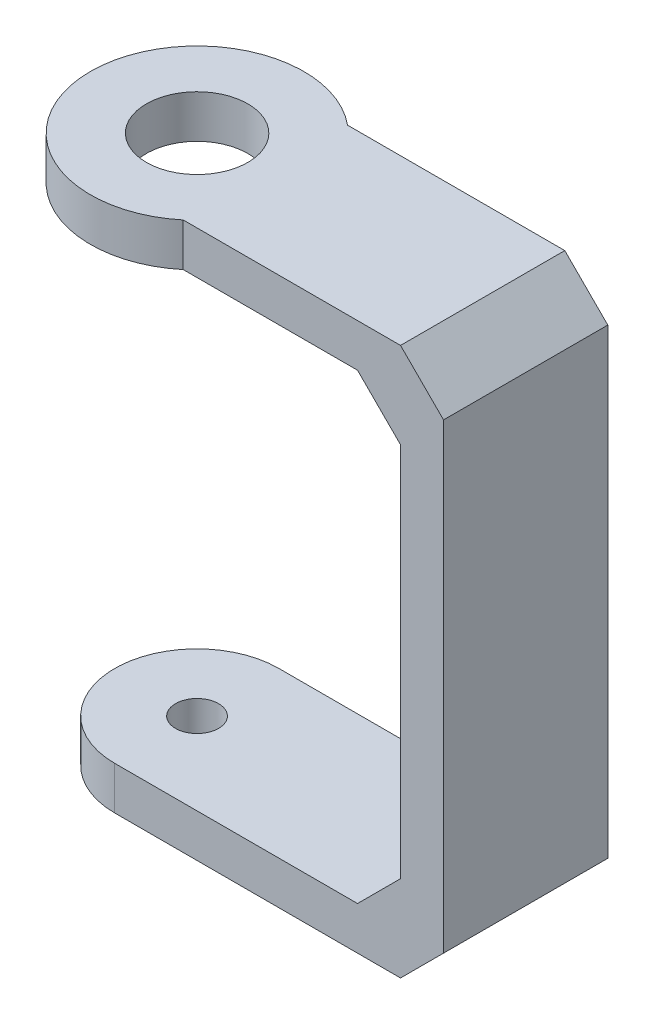
ISO-10303-21;
HEADER;
FILE_DESCRIPTION(('STEP AP214'),'2;1');
FILE_NAME('part.step','',(''),(''),'','','');
FILE_SCHEMA(('AUTOMOTIVE_DESIGN { 1 0 10303 214 1 1 1 1 }'));
ENDSEC;
DATA;
#1=APPLICATION_CONTEXT('core data for automotive mechanical design processes');
#2=APPLICATION_PROTOCOL_DEFINITION('international standard','automotive_design',2000,#1);
#3=PRODUCT_CONTEXT('',#1,'mechanical');
#4=PRODUCT('Part','Part','',(#3));
#5=PRODUCT_RELATED_PRODUCT_CATEGORY('part','',(#4));
#6=PRODUCT_DEFINITION_FORMATION('','',#4);
#7=PRODUCT_DEFINITION_CONTEXT('part definition',#1,'design');
#8=PRODUCT_DEFINITION('design','',#6,#7);
#9=PRODUCT_DEFINITION_SHAPE('','',#8);
#10=(LENGTH_UNIT() NAMED_UNIT(*) SI_UNIT(.MILLI.,.METRE.));
#11=(NAMED_UNIT(*) PLANE_ANGLE_UNIT() SI_UNIT($,.RADIAN.));
#12=(NAMED_UNIT(*) SI_UNIT($,.STERADIAN.) SOLID_ANGLE_UNIT());
#13=UNCERTAINTY_MEASURE_WITH_UNIT(LENGTH_MEASURE(1.E-05),#10,'distance_accuracy_value','');
#14=(GEOMETRIC_REPRESENTATION_CONTEXT(3) GLOBAL_UNCERTAINTY_ASSIGNED_CONTEXT((#13)) GLOBAL_UNIT_ASSIGNED_CONTEXT((#10,
#11,#12)) REPRESENTATION_CONTEXT('',''));
#15=CARTESIAN_POINT('',(0.,0.,0.));
#16=DIRECTION('',(0.,0.,1.));
#17=DIRECTION('',(1.,0.,0.));
#18=AXIS2_PLACEMENT_3D('',#15,#16,#17);
#19=CARTESIAN_POINT('',(23.7360999092236,38.9968362191147,-5.73));
#20=DIRECTION('',(0.70710700070138,0.707106561671647,0.));
#21=DIRECTION('',(-0.707106561671647,0.70710700070138,0.));
#22=AXIS2_PLACEMENT_3D('',#19,#20,#21);
#23=PLANE('',#22);
#24=DIRECTION('',(0.,0.,1.));
#25=VECTOR('',#24,1.);
#26=CARTESIAN_POINT('',(23.7360999092236,38.9968362191147,-5.73));
#27=LINE('',#26,#25);
#28=CARTESIAN_POINT('',(23.7360999092236,38.9968362191147,-5.73));
#29=VERTEX_POINT('',#28);
#30=CARTESIAN_POINT('',(23.7360999092236,38.9968362191147,5.73));
#31=VERTEX_POINT('',#30);
#32=EDGE_CURVE('E11',#29,#31,#27,.T.);
#33=ORIENTED_EDGE('',*,*,#32,.T.);
#34=DIRECTION('',(-0.707106561671647,0.70710700070138,0.));
#35=VECTOR('',#34,1.);
#36=CARTESIAN_POINT('',(23.7360999092236,38.9968362191147,5.73));
#37=LINE('',#36,#35);
#38=CARTESIAN_POINT('',(26.7361004009619,35.9968338647301,5.73));
#39=VERTEX_POINT('',#38);
#40=EDGE_CURVE('E202',#39,#31,#37,.T.);
#41=ORIENTED_EDGE('',*,*,#40,.F.);
#42=DIRECTION('',(0.,0.,1.));
#43=VECTOR('',#42,1.);
#44=CARTESIAN_POINT('',(26.7361004009619,35.9968338647301,-5.73));
#45=LINE('',#44,#43);
#46=CARTESIAN_POINT('',(26.7361004009619,35.9968338647301,-5.73));
#47=VERTEX_POINT('',#46);
#48=EDGE_CURVE('E42',#47,#39,#45,.T.);
#49=ORIENTED_EDGE('',*,*,#48,.F.);
#50=DIRECTION('',(-0.707106561671647,0.70710700070138,0.));
#51=VECTOR('',#50,1.);
#52=CARTESIAN_POINT('',(23.7360999092236,38.9968362191147,-5.73));
#53=LINE('',#52,#51);
#54=EDGE_CURVE('E49',#47,#29,#53,.T.);
#55=ORIENTED_EDGE('',*,*,#54,.T.);
#56=EDGE_LOOP('',(#33,#41,#49,#55));
#57=FACE_BOUND('',#56,.T.);
#58=ADVANCED_FACE('F33',(#57),#23,.T.);
#59=CARTESIAN_POINT('',(26.7361004009619,35.9968338647301,-5.73));
#60=DIRECTION('',(1.,0.,0.));
#61=DIRECTION('',(0.,1.,0.));
#62=AXIS2_PLACEMENT_3D('',#59,#60,#61);
#63=PLANE('',#62);
#64=ORIENTED_EDGE('',*,*,#48,.T.);
#65=DIRECTION('',(0.,1.,0.));
#66=VECTOR('',#65,1.);
#67=CARTESIAN_POINT('',(26.7361004009619,35.9968338647301,5.73));
#68=LINE('',#67,#66);
#69=CARTESIAN_POINT('',(26.7361004009619,3.77683532623596,5.73));
#70=VERTEX_POINT('',#69);
#71=EDGE_CURVE('E199',#70,#39,#68,.T.);
#72=ORIENTED_EDGE('',*,*,#71,.F.);
#73=DIRECTION('',(0.,0.,1.));
#74=VECTOR('',#73,1.);
#75=CARTESIAN_POINT('',(26.7361004009619,3.77683532623596,-5.73));
#76=LINE('',#75,#74);
#77=CARTESIAN_POINT('',(26.7361004009619,3.77683532623596,-5.73));
#78=VERTEX_POINT('',#77);
#79=EDGE_CURVE('E219',#78,#70,#76,.T.);
#80=ORIENTED_EDGE('',*,*,#79,.F.);
#81=DIRECTION('',(0.,1.,0.));
#82=VECTOR('',#81,1.);
#83=CARTESIAN_POINT('',(26.7361004009619,35.9968338647301,-5.73));
#84=LINE('',#83,#82);
#85=EDGE_CURVE('E215',#78,#47,#84,.T.);
#86=ORIENTED_EDGE('',*,*,#85,.T.);
#87=EDGE_LOOP('',(#64,#72,#80,#86));
#88=FACE_BOUND('',#87,.T.);
#89=ADVANCED_FACE('F257',(#88),#63,.T.);
#90=CARTESIAN_POINT('',(26.7361004009619,3.77683532623596,-5.73));
#91=DIRECTION('',(0.707106561671646,-0.707107000701381,0.));
#92=DIRECTION('',(0.707107000701381,0.707106561671646,0.));
#93=AXIS2_PLACEMENT_3D('',#90,#91,#92);
#94=PLANE('',#93);
#95=ORIENTED_EDGE('',*,*,#79,.T.);
#96=DIRECTION('',(0.707107000701381,0.707106561671646,0.));
#97=VECTOR('',#96,1.);
#98=CARTESIAN_POINT('',(26.7361004009619,3.77683532623596,5.73));
#99=LINE('',#98,#97);
#100=CARTESIAN_POINT('',(23.7360989779003,0.776835765820073,5.73));
#101=VERTEX_POINT('',#100);
#102=EDGE_CURVE('E196',#101,#70,#99,.T.);
#103=ORIENTED_EDGE('',*,*,#102,.F.);
#104=DIRECTION('',(0.,0.,1.));
#105=VECTOR('',#104,1.);
#106=CARTESIAN_POINT('',(23.7360989779003,0.776835765820073,-5.73));
#107=LINE('',#106,#105);
#108=CARTESIAN_POINT('',(23.7360989779003,0.776835765820073,-5.73));
#109=VERTEX_POINT('',#108);
#110=EDGE_CURVE('E221',#109,#101,#107,.T.);
#111=ORIENTED_EDGE('',*,*,#110,.F.);
#112=DIRECTION('',(0.707107000701381,0.707106561671646,0.));
#113=VECTOR('',#112,1.);
#114=CARTESIAN_POINT('',(26.7361004009619,3.77683532623596,-5.73));
#115=LINE('',#114,#113);
#116=EDGE_CURVE('E212',#109,#78,#115,.T.);
#117=ORIENTED_EDGE('',*,*,#116,.T.);
#118=EDGE_LOOP('',(#95,#103,#111,#117));
#119=FACE_BOUND('',#118,.T.);
#120=ADVANCED_FACE('F262',(#119),#94,.T.);
#121=CARTESIAN_POINT('',(20.7360984861625,3.77683812020412,-5.73));
#122=DIRECTION('',(-0.707106561671645,0.707107000701382,0.));
#123=DIRECTION('',(-0.707107000701382,-0.707106561671645,0.));
#124=AXIS2_PLACEMENT_3D('',#121,#122,#123);
#125=PLANE('',#124);
#126=DIRECTION('',(0.,0.,1.));
#127=VECTOR('',#126,1.);
#128=CARTESIAN_POINT('',(20.7360984861625,3.77683812020412,-5.73));
#129=LINE('',#128,#127);
#130=CARTESIAN_POINT('',(20.7360984861625,3.77683812020412,-5.73));
#131=VERTEX_POINT('',#130);
#132=CARTESIAN_POINT('',(20.7360984861625,3.77683812020412,5.73));
#133=VERTEX_POINT('',#132);
#134=EDGE_CURVE('E224',#131,#133,#129,.T.);
#135=ORIENTED_EDGE('',*,*,#134,.T.);
#136=DIRECTION('',(-0.707107000701382,-0.707106561671645,0.));
#137=VECTOR('',#136,1.);
#138=CARTESIAN_POINT('',(20.7360984861625,3.77683812020412,5.73));
#139=LINE('',#138,#137);
#140=CARTESIAN_POINT('',(23.7360989779009,6.77683674929729,5.73));
#141=VERTEX_POINT('',#140);
#142=EDGE_CURVE('E131',#141,#133,#139,.T.);
#143=ORIENTED_EDGE('',*,*,#142,.F.);
#144=DIRECTION('',(0.,0.,1.));
#145=VECTOR('',#144,1.);
#146=CARTESIAN_POINT('',(23.7360989779009,6.77683674929729,-5.73));
#147=LINE('',#146,#145);
#148=CARTESIAN_POINT('',(23.7360989779009,6.77683674929729,-5.73));
#149=VERTEX_POINT('',#148);
#150=EDGE_CURVE('E226',#149,#141,#147,.T.);
#151=ORIENTED_EDGE('',*,*,#150,.F.);
#152=DIRECTION('',(-0.707107000701382,-0.707106561671645,0.));
#153=VECTOR('',#152,1.);
#154=CARTESIAN_POINT('',(20.7360984861625,3.77683812020412,-5.73));
#155=LINE('',#154,#153);
#156=EDGE_CURVE('E210',#149,#131,#155,.T.);
#157=ORIENTED_EDGE('',*,*,#156,.T.);
#158=EDGE_LOOP('',(#135,#143,#151,#157));
#159=FACE_BOUND('',#158,.T.);
#160=ADVANCED_FACE('F254',(#159),#125,.T.);
#161=CARTESIAN_POINT('',(23.7360989779009,6.77683674929729,-5.73));
#162=DIRECTION('',(-1.,0.,0.));
#163=DIRECTION('',(0.,0.,1.));
#164=AXIS2_PLACEMENT_3D('',#161,#162,#163);
#165=PLANE('',#164);
#166=ORIENTED_EDGE('',*,*,#150,.T.);
#167=DIRECTION('',(0.,-1.,0.));
#168=VECTOR('',#167,1.);
#169=CARTESIAN_POINT('',(23.7360989779009,6.77683674929729,5.73));
#170=LINE('',#169,#168);
#171=CARTESIAN_POINT('',(23.7360989779009,32.9968380296051,5.73));
#172=VERTEX_POINT('',#171);
#173=EDGE_CURVE('E193',#172,#141,#170,.T.);
#174=ORIENTED_EDGE('',*,*,#173,.F.);
#175=DIRECTION('',(0.,0.,1.));
#176=VECTOR('',#175,1.);
#177=CARTESIAN_POINT('',(23.7360989779009,32.9968380296051,-5.73));
#178=LINE('',#177,#176);
#179=CARTESIAN_POINT('',(23.7360989779009,32.9968380296051,-5.73));
#180=VERTEX_POINT('',#179);
#181=EDGE_CURVE('E227',#180,#172,#178,.T.);
#182=ORIENTED_EDGE('',*,*,#181,.F.);
#183=DIRECTION('',(0.,-1.,0.));
#184=VECTOR('',#183,1.);
#185=CARTESIAN_POINT('',(23.7360989779009,6.77683674929729,-5.73));
#186=LINE('',#185,#184);
#187=EDGE_CURVE('E207',#180,#149,#186,.T.);
#188=ORIENTED_EDGE('',*,*,#187,.T.);
#189=EDGE_LOOP('',(#166,#174,#182,#188));
#190=FACE_BOUND('',#189,.T.);
#191=ADVANCED_FACE('F248',(#190),#165,.T.);
#192=CARTESIAN_POINT('',(23.7360989779009,32.9968380296051,-5.73));
#193=DIRECTION('',(-0.70710700070138,-0.707106561671647,0.));
#194=DIRECTION('',(0.707106561671647,-0.70710700070138,0.));
#195=AXIS2_PLACEMENT_3D('',#192,#193,#194);
#196=PLANE('',#195);
#197=ORIENTED_EDGE('',*,*,#181,.T.);
#198=DIRECTION('',(0.707106561671647,-0.70710700070138,0.));
#199=VECTOR('',#198,1.);
#200=CARTESIAN_POINT('',(23.7360989779009,32.9968380296051,5.73));
#201=LINE('',#200,#199);
#202=CARTESIAN_POINT('',(20.7361003488077,35.9968385213434,5.73));
#203=VERTEX_POINT('',#202);
#204=EDGE_CURVE('E188',#203,#172,#201,.T.);
#205=ORIENTED_EDGE('',*,*,#204,.F.);
#206=DIRECTION('',(0.,0.,1.));
#207=VECTOR('',#206,1.);
#208=CARTESIAN_POINT('',(20.7361003488077,35.9968385213434,-5.73));
#209=LINE('',#208,#207);
#210=CARTESIAN_POINT('',(20.7361003488077,35.9968385213434,-5.73));
#211=VERTEX_POINT('',#210);
#212=EDGE_CURVE('E37',#211,#203,#209,.T.);
#213=ORIENTED_EDGE('',*,*,#212,.F.);
#214=DIRECTION('',(0.707106561671647,-0.70710700070138,0.));
#215=VECTOR('',#214,1.);
#216=CARTESIAN_POINT('',(23.7360989779009,32.9968380296051,-5.73));
#217=LINE('',#216,#215);
#218=EDGE_CURVE('E204',#211,#180,#217,.T.);
#219=ORIENTED_EDGE('',*,*,#218,.T.);
#220=EDGE_LOOP('',(#197,#205,#213,#219));
#221=FACE_BOUND('',#220,.T.);
#222=ADVANCED_FACE('F35',(#221),#196,.T.);
#223=CARTESIAN_POINT('',(0.,0.,-5.73));
#224=DIRECTION('',(0.,0.,-1.));
#225=DIRECTION('',(-1.,0.,0.));
#226=AXIS2_PLACEMENT_3D('',#223,#224,#225);
#227=PLANE('',#226);
#228=ORIENTED_EDGE('',*,*,#218,.F.);
#229=DIRECTION('',(1.,0.,0.));
#230=VECTOR('',#229,1.);
#231=CARTESIAN_POINT('',(8.57610034880768,35.9968385213434,-5.73));
#232=LINE('',#231,#230);
#233=CARTESIAN_POINT('',(8.57610034880768,35.9968362191147,-5.73));
#234=VERTEX_POINT('',#233);
#235=EDGE_CURVE('E136',#234,#211,#232,.T.);
#236=ORIENTED_EDGE('',*,*,#235,.F.);
#237=DIRECTION('',(0.,-1.,0.));
#238=VECTOR('',#237,1.);
#239=CARTESIAN_POINT('',(8.57610034880768,38.9968362191147,-5.73));
#240=LINE('',#239,#238);
#241=CARTESIAN_POINT('',(8.57610034880768,38.9968362191147,-5.73));
#242=VERTEX_POINT('',#241);
#243=EDGE_CURVE('E173',#242,#234,#240,.T.);
#244=ORIENTED_EDGE('',*,*,#243,.F.);
#245=DIRECTION('',(-1.,0.,0.));
#246=VECTOR('',#245,1.);
#247=CARTESIAN_POINT('',(20.7361003488077,38.9968362191147,-5.73));
#248=LINE('',#247,#246);
#249=EDGE_CURVE('E170',#29,#242,#248,.T.);
#250=ORIENTED_EDGE('',*,*,#249,.F.);
#251=ORIENTED_EDGE('',*,*,#54,.F.);
#252=ORIENTED_EDGE('',*,*,#85,.F.);
#253=ORIENTED_EDGE('',*,*,#116,.F.);
#254=DIRECTION('',(1.,0.,0.));
#255=VECTOR('',#254,1.);
#256=CARTESIAN_POINT('',(8.57609848616254,0.776835765820071,-5.73));
#257=LINE('',#256,#255);
#258=CARTESIAN_POINT('',(3.79307817414659,0.776835765820073,-5.73));
#259=VERTEX_POINT('',#258);
#260=EDGE_CURVE('E186',#259,#109,#257,.T.);
#261=ORIENTED_EDGE('',*,*,#260,.F.);
#262=DIRECTION('',(0.,-1.,0.));
#263=VECTOR('',#262,1.);
#264=CARTESIAN_POINT('',(3.79307817414659,3.77683576582007,-5.73));
#265=LINE('',#264,#263);
#266=CARTESIAN_POINT('',(3.79307817414659,3.77683576582007,-5.73));
#267=VERTEX_POINT('',#266);
#268=EDGE_CURVE('E145',#267,#259,#265,.T.);
#269=ORIENTED_EDGE('',*,*,#268,.F.);
#270=DIRECTION('',(-1.,0.,0.));
#271=VECTOR('',#270,1.);
#272=CARTESIAN_POINT('',(20.7360984861625,3.77683812020412,-5.73));
#273=LINE('',#272,#271);
#274=EDGE_CURVE('E149',#131,#267,#273,.T.);
#275=ORIENTED_EDGE('',*,*,#274,.F.);
#276=ORIENTED_EDGE('',*,*,#156,.F.);
#277=ORIENTED_EDGE('',*,*,#187,.F.);
#278=EDGE_LOOP('',(#228,#236,#244,#250,#251,#252,#253,#261,#269,#275,#276,#277));
#279=FACE_BOUND('',#278,.T.);
#280=ADVANCED_FACE('F243',(#279),#227,.T.);
#281=CARTESIAN_POINT('',(0.,0.,5.73));
#282=DIRECTION('',(0.,0.,-1.));
#283=DIRECTION('',(-1.,0.,0.));
#284=AXIS2_PLACEMENT_3D('',#281,#282,#283);
#285=PLANE('',#284);
#286=ORIENTED_EDGE('',*,*,#40,.T.);
#287=DIRECTION('',(-1.,0.,0.));
#288=VECTOR('',#287,1.);
#289=CARTESIAN_POINT('',(20.7361003488077,38.9968362191147,5.73));
#290=LINE('',#289,#288);
#291=CARTESIAN_POINT('',(8.57610034880768,38.9968362191147,5.73));
#292=VERTEX_POINT('',#291);
#293=EDGE_CURVE('E168',#31,#292,#290,.T.);
#294=ORIENTED_EDGE('',*,*,#293,.T.);
#295=DIRECTION('',(0.,-1.,0.));
#296=VECTOR('',#295,1.);
#297=CARTESIAN_POINT('',(8.57610034880768,38.9968362191147,5.73));
#298=LINE('',#297,#296);
#299=CARTESIAN_POINT('',(8.57610034880768,35.9968362191147,5.73));
#300=VERTEX_POINT('',#299);
#301=EDGE_CURVE('E180',#292,#300,#298,.T.);
#302=ORIENTED_EDGE('',*,*,#301,.T.);
#303=DIRECTION('',(1.,0.,0.));
#304=VECTOR('',#303,1.);
#305=CARTESIAN_POINT('',(8.57610034880768,35.9968385213434,5.73));
#306=LINE('',#305,#304);
#307=EDGE_CURVE('E174',#300,#203,#306,.T.);
#308=ORIENTED_EDGE('',*,*,#307,.T.);
#309=ORIENTED_EDGE('',*,*,#204,.T.);
#310=ORIENTED_EDGE('',*,*,#173,.T.);
#311=ORIENTED_EDGE('',*,*,#142,.T.);
#312=DIRECTION('',(-1.,0.,0.));
#313=VECTOR('',#312,1.);
#314=CARTESIAN_POINT('',(20.7360984861625,3.77683812020412,5.73));
#315=LINE('',#314,#313);
#316=CARTESIAN_POINT('',(3.79307817414659,3.77683576582007,5.73));
#317=VERTEX_POINT('',#316);
#318=EDGE_CURVE('E122',#133,#317,#315,.T.);
#319=ORIENTED_EDGE('',*,*,#318,.T.);
#320=DIRECTION('',(0.,-1.,0.));
#321=VECTOR('',#320,1.);
#322=CARTESIAN_POINT('',(3.79307817414659,3.77683576582007,5.73));
#323=LINE('',#322,#321);
#324=CARTESIAN_POINT('',(3.79307817414659,0.776835765820073,5.73));
#325=VERTEX_POINT('',#324);
#326=EDGE_CURVE('E127',#317,#325,#323,.T.);
#327=ORIENTED_EDGE('',*,*,#326,.T.);
#328=DIRECTION('',(-1.,0.,0.));
#329=VECTOR('',#328,1.);
#330=CARTESIAN_POINT('',(23.7360989779003,0.776835765820073,5.73));
#331=LINE('',#330,#329);
#332=EDGE_CURVE('E135',#101,#325,#331,.T.);
#333=ORIENTED_EDGE('',*,*,#332,.F.);
#334=ORIENTED_EDGE('',*,*,#102,.T.);
#335=ORIENTED_EDGE('',*,*,#71,.T.);
#336=EDGE_LOOP('',(#286,#294,#302,#308,#309,#310,#311,#319,#327,#333,#334,#335));
#337=FACE_BOUND('',#336,.T.);
#338=ADVANCED_FACE('F125',(#337),#285,.F.);
#339=CARTESIAN_POINT('',(23.7360989779003,0.776835765820073,-5.73));
#340=DIRECTION('',(0.,1.,0.));
#341=DIRECTION('',(0.,0.,1.));
#342=AXIS2_PLACEMENT_3D('',#339,#340,#341);
#343=PLANE('',#342);
#344=CARTESIAN_POINT('',(3.81,0.776838120204118,0.));
#345=DIRECTION('',(0.,1.,0.));
#346=DIRECTION('',(-1.,0.,0.));
#347=AXIS2_PLACEMENT_3D('',#344,#345,#346);
#348=CIRCLE('',#347,1.5);
#349=CARTESIAN_POINT('',(2.31,0.776838120204118,0.));
#350=VERTEX_POINT('',#349);
#351=EDGE_CURVE('E152',#350,#350,#348,.T.);
#352=ORIENTED_EDGE('',*,*,#351,.T.);
#353=EDGE_LOOP('',(#352));
#354=FACE_BOUND('',#353,.T.);
#355=ORIENTED_EDGE('',*,*,#332,.T.);
#356=CARTESIAN_POINT('',(3.79307817414659,0.776835765820073,0.));
#357=DIRECTION('',(0.,-1.,0.));
#358=DIRECTION('',(0.,0.,-1.));
#359=AXIS2_PLACEMENT_3D('',#356,#357,#358);
#360=CIRCLE('',#359,5.73);
#361=EDGE_CURVE('E144',#325,#259,#360,.T.);
#362=ORIENTED_EDGE('',*,*,#361,.T.);
#363=ORIENTED_EDGE('',*,*,#260,.T.);
#364=ORIENTED_EDGE('',*,*,#110,.T.);
#365=EDGE_LOOP('',(#355,#362,#363,#364));
#366=FACE_BOUND('',#365,.T.);
#367=ADVANCED_FACE('F275',(#354,#366),#343,.F.);
#368=CARTESIAN_POINT('',(20.7360984861625,3.77683812020412,-5.73));
#369=DIRECTION('',(0.,1.,0.));
#370=DIRECTION('',(-1.,0.,0.));
#371=AXIS2_PLACEMENT_3D('',#368,#369,#370);
#372=PLANE('',#371);
#373=CARTESIAN_POINT('',(3.81,3.77683812020412,0.));
#374=DIRECTION('',(0.,1.,0.));
#375=DIRECTION('',(-1.,0.,0.));
#376=AXIS2_PLACEMENT_3D('',#373,#374,#375);
#377=CIRCLE('',#376,1.5);
#378=CARTESIAN_POINT('',(2.31,3.77683812020412,0.));
#379=VERTEX_POINT('',#378);
#380=EDGE_CURVE('E155',#379,#379,#377,.T.);
#381=ORIENTED_EDGE('',*,*,#380,.F.);
#382=EDGE_LOOP('',(#381));
#383=FACE_BOUND('',#382,.T.);
#384=ORIENTED_EDGE('',*,*,#318,.F.);
#385=ORIENTED_EDGE('',*,*,#134,.F.);
#386=ORIENTED_EDGE('',*,*,#274,.T.);
#387=CARTESIAN_POINT('',(3.79307817414659,3.77683576582007,0.));
#388=DIRECTION('',(0.,-1.,0.));
#389=DIRECTION('',(0.,0.,-1.));
#390=AXIS2_PLACEMENT_3D('',#387,#388,#389);
#391=CIRCLE('',#390,5.73);
#392=EDGE_CURVE('E142',#317,#267,#391,.T.);
#393=ORIENTED_EDGE('',*,*,#392,.F.);
#394=EDGE_LOOP('',(#384,#385,#386,#393));
#395=FACE_BOUND('',#394,.T.);
#396=ADVANCED_FACE('F147',(#383,#395),#372,.T.);
#397=CARTESIAN_POINT('',(8.57610034880768,35.9968385213434,-5.73));
#398=DIRECTION('',(0.,-1.,0.));
#399=DIRECTION('',(0.,0.,-1.));
#400=AXIS2_PLACEMENT_3D('',#397,#398,#399);
#401=PLANE('',#400);
#402=CARTESIAN_POINT('',(3.81484001146002,35.9968362191147,0.));
#403=DIRECTION('',(0.,1.,0.));
#404=DIRECTION('',(0.,0.,1.));
#405=AXIS2_PLACEMENT_3D('',#402,#403,#404);
#406=CIRCLE('',#405,3.54);
#407=CARTESIAN_POINT('',(3.81484001146002,35.9968362191147,3.54));
#408=VERTEX_POINT('',#407);
#409=EDGE_CURVE('E160',#408,#408,#406,.T.);
#410=ORIENTED_EDGE('',*,*,#409,.T.);
#411=EDGE_LOOP('',(#410));
#412=FACE_BOUND('',#411,.T.);
#413=ORIENTED_EDGE('',*,*,#307,.F.);
#414=CARTESIAN_POINT('',(3.81484001146002,35.9968362191147,0.));
#415=DIRECTION('',(0.,1.,0.));
#416=DIRECTION('',(0.,0.,1.));
#417=AXIS2_PLACEMENT_3D('',#414,#415,#416);
#418=CIRCLE('',#417,7.45);
#419=EDGE_CURVE('E166',#234,#300,#418,.T.);
#420=ORIENTED_EDGE('',*,*,#419,.F.);
#421=ORIENTED_EDGE('',*,*,#235,.T.);
#422=ORIENTED_EDGE('',*,*,#212,.T.);
#423=EDGE_LOOP('',(#413,#420,#421,#422));
#424=FACE_BOUND('',#423,.T.);
#425=ADVANCED_FACE('F233',(#412,#424),#401,.T.);
#426=CARTESIAN_POINT('',(20.7361003488077,38.9968362191147,-5.73));
#427=DIRECTION('',(0.,1.,0.));
#428=DIRECTION('',(0.,0.,1.));
#429=AXIS2_PLACEMENT_3D('',#426,#427,#428);
#430=PLANE('',#429);
#431=CARTESIAN_POINT('',(3.81484001146002,38.9968362191147,0.));
#432=DIRECTION('',(0.,1.,0.));
#433=DIRECTION('',(0.,0.,1.));
#434=AXIS2_PLACEMENT_3D('',#431,#432,#433);
#435=CIRCLE('',#434,3.54);
#436=CARTESIAN_POINT('',(3.81484001146002,38.9968362191147,3.54));
#437=VERTEX_POINT('',#436);
#438=EDGE_CURVE('E158',#437,#437,#435,.T.);
#439=ORIENTED_EDGE('',*,*,#438,.F.);
#440=EDGE_LOOP('',(#439));
#441=FACE_BOUND('',#440,.T.);
#442=ORIENTED_EDGE('',*,*,#293,.F.);
#443=ORIENTED_EDGE('',*,*,#32,.F.);
#444=ORIENTED_EDGE('',*,*,#249,.T.);
#445=CARTESIAN_POINT('',(3.81484001146002,38.9968362191147,0.));
#446=DIRECTION('',(0.,1.,0.));
#447=DIRECTION('',(0.,0.,1.));
#448=AXIS2_PLACEMENT_3D('',#445,#446,#447);
#449=CIRCLE('',#448,7.45);
#450=EDGE_CURVE('E163',#242,#292,#449,.T.);
#451=ORIENTED_EDGE('',*,*,#450,.T.);
#452=EDGE_LOOP('',(#442,#443,#444,#451));
#453=FACE_BOUND('',#452,.T.);
#454=ADVANCED_FACE('F280',(#441,#453),#430,.T.);
#455=CARTESIAN_POINT('',(3.81484001146002,35.9968362191147,0.));
#456=DIRECTION('',(0.,1.,0.));
#457=DIRECTION('',(0.,0.,1.));
#458=AXIS2_PLACEMENT_3D('',#455,#456,#457);
#459=CYLINDRICAL_SURFACE('',#458,7.45);
#460=ORIENTED_EDGE('',*,*,#450,.F.);
#461=ORIENTED_EDGE('',*,*,#243,.T.);
#462=ORIENTED_EDGE('',*,*,#419,.T.);
#463=ORIENTED_EDGE('',*,*,#301,.F.);
#464=EDGE_LOOP('',(#460,#461,#462,#463));
#465=FACE_BOUND('',#464,.T.);
#466=ADVANCED_FACE('F240',(#465),#459,.T.);
#467=CARTESIAN_POINT('',(3.81484001146002,35.9968362191147,0.));
#468=DIRECTION('',(0.,1.,0.));
#469=DIRECTION('',(0.,0.,1.));
#470=AXIS2_PLACEMENT_3D('',#467,#468,#469);
#471=CYLINDRICAL_SURFACE('',#470,3.54);
#472=ORIENTED_EDGE('',*,*,#409,.F.);
#473=EDGE_LOOP('',(#472));
#474=FACE_BOUND('',#473,.T.);
#475=ORIENTED_EDGE('',*,*,#438,.T.);
#476=EDGE_LOOP('',(#475));
#477=FACE_BOUND('',#476,.T.);
#478=ADVANCED_FACE('F288',(#474,#477),#471,.F.);
#479=CARTESIAN_POINT('',(3.79307817414659,3.77683576582007,0.));
#480=DIRECTION('',(0.,-1.,0.));
#481=DIRECTION('',(0.,0.,-1.));
#482=AXIS2_PLACEMENT_3D('',#479,#480,#481);
#483=CYLINDRICAL_SURFACE('',#482,5.73);
#484=ORIENTED_EDGE('',*,*,#361,.F.);
#485=ORIENTED_EDGE('',*,*,#326,.F.);
#486=ORIENTED_EDGE('',*,*,#392,.T.);
#487=ORIENTED_EDGE('',*,*,#268,.T.);
#488=EDGE_LOOP('',(#484,#485,#486,#487));
#489=FACE_BOUND('',#488,.T.);
#490=ADVANCED_FACE('F140',(#489),#483,.T.);
#491=CARTESIAN_POINT('',(3.81,0.776838120204118,0.));
#492=DIRECTION('',(0.,1.,0.));
#493=DIRECTION('',(-1.,0.,0.));
#494=AXIS2_PLACEMENT_3D('',#491,#492,#493);
#495=CYLINDRICAL_SURFACE('',#494,1.5);
#496=ORIENTED_EDGE('',*,*,#351,.F.);
#497=EDGE_LOOP('',(#496));
#498=FACE_BOUND('',#497,.T.);
#499=ORIENTED_EDGE('',*,*,#380,.T.);
#500=EDGE_LOOP('',(#499));
#501=FACE_BOUND('',#500,.T.);
#502=ADVANCED_FACE('F370',(#498,#501),#495,.F.);
#503=CLOSED_SHELL('',(#58,#89,#120,#160,#191,#222,#280,#338,#367,#396,#425,#454,#466,#478,#490,#502));
#504=MANIFOLD_SOLID_BREP('B2',#503);
#505=ADVANCED_BREP_SHAPE_REPRESENTATION('',(#18,#504),#14);
#506=SHAPE_DEFINITION_REPRESENTATION(#9,#505);
ENDSEC;
END-ISO-10303-21;
